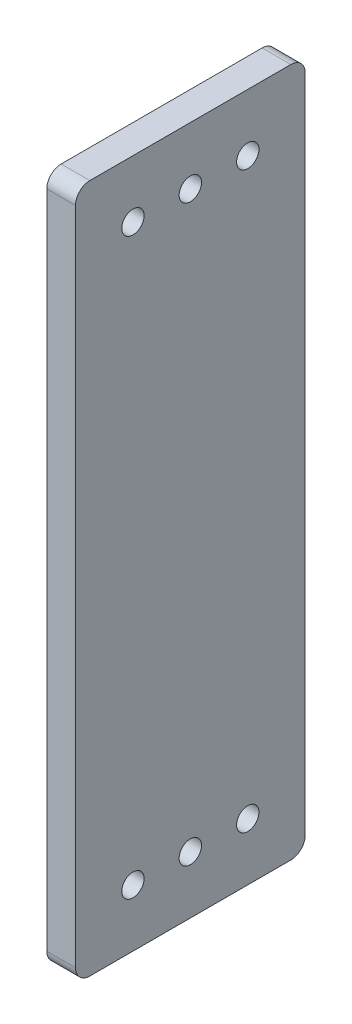
ISO-10303-21;
HEADER;
FILE_DESCRIPTION(('STEP AP214'),'2;1');
FILE_NAME('part.step','',(''),(''),'','','');
FILE_SCHEMA(('AUTOMOTIVE_DESIGN { 1 0 10303 214 1 1 1 1 }'));
ENDSEC;
DATA;
#1=APPLICATION_CONTEXT('core data for automotive mechanical design processes');
#2=APPLICATION_PROTOCOL_DEFINITION('international standard','automotive_design',2000,#1);
#3=PRODUCT_CONTEXT('',#1,'mechanical');
#4=PRODUCT('Part','Part','',(#3));
#5=PRODUCT_RELATED_PRODUCT_CATEGORY('part','',(#4));
#6=PRODUCT_DEFINITION_FORMATION('','',#4);
#7=PRODUCT_DEFINITION_CONTEXT('part definition',#1,'design');
#8=PRODUCT_DEFINITION('design','',#6,#7);
#9=PRODUCT_DEFINITION_SHAPE('','',#8);
#10=(LENGTH_UNIT() NAMED_UNIT(*) SI_UNIT(.MILLI.,.METRE.));
#11=(NAMED_UNIT(*) PLANE_ANGLE_UNIT() SI_UNIT($,.RADIAN.));
#12=(NAMED_UNIT(*) SI_UNIT($,.STERADIAN.) SOLID_ANGLE_UNIT());
#13=UNCERTAINTY_MEASURE_WITH_UNIT(LENGTH_MEASURE(1.E-05),#10,'distance_accuracy_value','');
#14=(GEOMETRIC_REPRESENTATION_CONTEXT(3) GLOBAL_UNCERTAINTY_ASSIGNED_CONTEXT((#13)) GLOBAL_UNIT_ASSIGNED_CONTEXT((#10,
#11,#12)) REPRESENTATION_CONTEXT('',''));
#15=CARTESIAN_POINT('',(0.,0.,0.));
#16=DIRECTION('',(0.,0.,1.));
#17=DIRECTION('',(1.,0.,0.));
#18=AXIS2_PLACEMENT_3D('',#15,#16,#17);
#19=CARTESIAN_POINT('',(44.45,177.8,-50.8));
#20=DIRECTION('',(0.,0.,1.));
#21=DIRECTION('',(1.,0.,0.));
#22=AXIS2_PLACEMENT_3D('',#19,#20,#21);
#23=PLANE('',#22);
#24=DIRECTION('',(0.,1.,0.));
#25=VECTOR('',#24,1.);
#26=CARTESIAN_POINT('',(44.45,177.8,-50.8));
#27=LINE('',#26,#25);
#28=CARTESIAN_POINT('',(44.45,28.575,-50.8));
#29=VERTEX_POINT('',#28);
#30=CARTESIAN_POINT('',(44.45,174.625,-50.8));
#31=VERTEX_POINT('',#30);
#32=EDGE_CURVE('E124',#29,#31,#27,.T.);
#33=ORIENTED_EDGE('',*,*,#32,.F.);
#34=DIRECTION('',(-1.,0.,0.));
#35=VECTOR('',#34,1.);
#36=CARTESIAN_POINT('',(44.45,28.575,-50.8));
#37=LINE('',#36,#35);
#38=CARTESIAN_POINT('',(38.1,28.575,-50.8));
#39=VERTEX_POINT('',#38);
#40=EDGE_CURVE('E109',#29,#39,#37,.T.);
#41=ORIENTED_EDGE('',*,*,#40,.T.);
#42=DIRECTION('',(0.,1.,0.));
#43=VECTOR('',#42,1.);
#44=CARTESIAN_POINT('',(38.1,177.8,-50.8));
#45=LINE('',#44,#43);
#46=CARTESIAN_POINT('',(38.1,174.625,-50.8));
#47=VERTEX_POINT('',#46);
#48=EDGE_CURVE('E121',#39,#47,#45,.T.);
#49=ORIENTED_EDGE('',*,*,#48,.T.);
#50=DIRECTION('',(-1.,0.,0.));
#51=VECTOR('',#50,1.);
#52=CARTESIAN_POINT('',(44.45,174.625,-50.8));
#53=LINE('',#52,#51);
#54=EDGE_CURVE('E126',#47,#31,#53,.F.);
#55=ORIENTED_EDGE('',*,*,#54,.T.);
#56=EDGE_LOOP('',(#33,#41,#49,#55));
#57=FACE_BOUND('',#56,.T.);
#58=ADVANCED_FACE('F39',(#57),#23,.F.);
#59=CARTESIAN_POINT('',(44.45,177.8,-50.8));
#60=DIRECTION('',(0.,-1.,0.));
#61=DIRECTION('',(0.,0.,-1.));
#62=AXIS2_PLACEMENT_3D('',#59,#60,#61);
#63=PLANE('',#62);
#64=DIRECTION('',(0.,0.,1.));
#65=VECTOR('',#64,1.);
#66=CARTESIAN_POINT('',(38.1,177.8,-50.8));
#67=LINE('',#66,#65);
#68=CARTESIAN_POINT('',(38.1,177.8,-47.625));
#69=VERTEX_POINT('',#68);
#70=CARTESIAN_POINT('',(38.1,177.8,-3.17500000000001));
#71=VERTEX_POINT('',#70);
#72=EDGE_CURVE('E131',#69,#71,#67,.T.);
#73=ORIENTED_EDGE('',*,*,#72,.T.);
#74=DIRECTION('',(-1.,0.,0.));
#75=VECTOR('',#74,1.);
#76=CARTESIAN_POINT('',(44.45,177.8,-3.175));
#77=LINE('',#76,#75);
#78=CARTESIAN_POINT('',(44.45,177.8,-3.17500000000001));
#79=VERTEX_POINT('',#78);
#80=EDGE_CURVE('E11',#71,#79,#77,.F.);
#81=ORIENTED_EDGE('',*,*,#80,.T.);
#82=DIRECTION('',(0.,0.,1.));
#83=VECTOR('',#82,1.);
#84=CARTESIAN_POINT('',(44.45,177.8,-50.8));
#85=LINE('',#84,#83);
#86=CARTESIAN_POINT('',(44.45,177.8,-47.625));
#87=VERTEX_POINT('',#86);
#88=EDGE_CURVE('E170',#87,#79,#85,.T.);
#89=ORIENTED_EDGE('',*,*,#88,.F.);
#90=DIRECTION('',(-1.,0.,0.));
#91=VECTOR('',#90,1.);
#92=CARTESIAN_POINT('',(44.45,177.8,-47.625));
#93=LINE('',#92,#91);
#94=EDGE_CURVE('E47',#87,#69,#93,.T.);
#95=ORIENTED_EDGE('',*,*,#94,.T.);
#96=EDGE_LOOP('',(#73,#81,#89,#95));
#97=FACE_BOUND('',#96,.T.);
#98=ADVANCED_FACE('F168',(#97),#63,.F.);
#99=CARTESIAN_POINT('',(44.45,177.8,0.));
#100=DIRECTION('',(0.,0.,-1.));
#101=DIRECTION('',(-1.,0.,0.));
#102=AXIS2_PLACEMENT_3D('',#99,#100,#101);
#103=PLANE('',#102);
#104=DIRECTION('',(0.,-1.,0.));
#105=VECTOR('',#104,1.);
#106=CARTESIAN_POINT('',(44.45,177.8,0.));
#107=LINE('',#106,#105);
#108=CARTESIAN_POINT('',(44.45,174.625,0.));
#109=VERTEX_POINT('',#108);
#110=CARTESIAN_POINT('',(44.45,28.575,0.));
#111=VERTEX_POINT('',#110);
#112=EDGE_CURVE('E178',#109,#111,#107,.T.);
#113=ORIENTED_EDGE('',*,*,#112,.F.);
#114=DIRECTION('',(-1.,0.,0.));
#115=VECTOR('',#114,1.);
#116=CARTESIAN_POINT('',(44.45,174.625,0.));
#117=LINE('',#116,#115);
#118=CARTESIAN_POINT('',(38.1,174.625,0.));
#119=VERTEX_POINT('',#118);
#120=EDGE_CURVE('E162',#109,#119,#117,.T.);
#121=ORIENTED_EDGE('',*,*,#120,.T.);
#122=DIRECTION('',(0.,-1.,0.));
#123=VECTOR('',#122,1.);
#124=CARTESIAN_POINT('',(38.1,177.8,0.));
#125=LINE('',#124,#123);
#126=CARTESIAN_POINT('',(38.1,28.575,0.));
#127=VERTEX_POINT('',#126);
#128=EDGE_CURVE('E135',#119,#127,#125,.T.);
#129=ORIENTED_EDGE('',*,*,#128,.T.);
#130=DIRECTION('',(-1.,0.,0.));
#131=VECTOR('',#130,1.);
#132=CARTESIAN_POINT('',(44.45,28.575,0.));
#133=LINE('',#132,#131);
#134=EDGE_CURVE('E54',#127,#111,#133,.F.);
#135=ORIENTED_EDGE('',*,*,#134,.T.);
#136=EDGE_LOOP('',(#113,#121,#129,#135));
#137=FACE_BOUND('',#136,.T.);
#138=ADVANCED_FACE('F177',(#137),#103,.F.);
#139=CARTESIAN_POINT('',(44.45,25.4,-50.8));
#140=DIRECTION('',(0.,1.,0.));
#141=DIRECTION('',(0.,0.,1.));
#142=AXIS2_PLACEMENT_3D('',#139,#140,#141);
#143=PLANE('',#142);
#144=DIRECTION('',(0.,0.,-1.));
#145=VECTOR('',#144,1.);
#146=CARTESIAN_POINT('',(38.1,25.4,-50.8));
#147=LINE('',#146,#145);
#148=CARTESIAN_POINT('',(38.1,25.4,-3.17500000000001));
#149=VERTEX_POINT('',#148);
#150=CARTESIAN_POINT('',(38.1,25.4,-47.625));
#151=VERTEX_POINT('',#150);
#152=EDGE_CURVE('E145',#149,#151,#147,.T.);
#153=ORIENTED_EDGE('',*,*,#152,.T.);
#154=DIRECTION('',(-1.,0.,0.));
#155=VECTOR('',#154,1.);
#156=CARTESIAN_POINT('',(44.45,25.4,-47.625));
#157=LINE('',#156,#155);
#158=CARTESIAN_POINT('',(44.45,25.4,-47.625));
#159=VERTEX_POINT('',#158);
#160=EDGE_CURVE('E110',#151,#159,#157,.F.);
#161=ORIENTED_EDGE('',*,*,#160,.T.);
#162=DIRECTION('',(0.,0.,-1.));
#163=VECTOR('',#162,1.);
#164=CARTESIAN_POINT('',(44.45,25.4,-50.8));
#165=LINE('',#164,#163);
#166=CARTESIAN_POINT('',(44.45,25.4,-3.17500000000001));
#167=VERTEX_POINT('',#166);
#168=EDGE_CURVE('E141',#167,#159,#165,.T.);
#169=ORIENTED_EDGE('',*,*,#168,.F.);
#170=DIRECTION('',(-1.,0.,0.));
#171=VECTOR('',#170,1.);
#172=CARTESIAN_POINT('',(44.45,25.4,-3.175));
#173=LINE('',#172,#171);
#174=EDGE_CURVE('E115',#167,#149,#173,.T.);
#175=ORIENTED_EDGE('',*,*,#174,.T.);
#176=EDGE_LOOP('',(#153,#161,#169,#175));
#177=FACE_BOUND('',#176,.T.);
#178=ADVANCED_FACE('F223',(#177),#143,.F.);
#179=CARTESIAN_POINT('',(44.45,0.,0.));
#180=DIRECTION('',(-1.,0.,0.));
#181=DIRECTION('',(0.,0.,1.));
#182=AXIS2_PLACEMENT_3D('',#179,#180,#181);
#183=PLANE('',#182);
#184=CARTESIAN_POINT('',(44.45,38.1,-12.7));
#185=DIRECTION('',(-1.,0.,0.));
#186=DIRECTION('',(0.,0.,1.));
#187=AXIS2_PLACEMENT_3D('',#184,#185,#186);
#188=CIRCLE('',#187,2.4765);
#189=CARTESIAN_POINT('',(44.45,38.1,-10.2235));
#190=VERTEX_POINT('',#189);
#191=EDGE_CURVE('E191',#190,#190,#188,.F.);
#192=ORIENTED_EDGE('',*,*,#191,.F.);
#193=EDGE_LOOP('',(#192));
#194=FACE_BOUND('',#193,.T.);
#195=CARTESIAN_POINT('',(44.45,38.1,-25.4));
#196=DIRECTION('',(-1.,0.,0.));
#197=DIRECTION('',(0.,0.,1.));
#198=AXIS2_PLACEMENT_3D('',#195,#196,#197);
#199=CIRCLE('',#198,2.4765);
#200=CARTESIAN_POINT('',(44.45,38.1,-22.9235));
#201=VERTEX_POINT('',#200);
#202=EDGE_CURVE('E190',#201,#201,#199,.F.);
#203=ORIENTED_EDGE('',*,*,#202,.F.);
#204=EDGE_LOOP('',(#203));
#205=FACE_BOUND('',#204,.T.);
#206=CARTESIAN_POINT('',(44.45,38.1,-38.1));
#207=DIRECTION('',(-1.,0.,0.));
#208=DIRECTION('',(0.,0.,1.));
#209=AXIS2_PLACEMENT_3D('',#206,#207,#208);
#210=CIRCLE('',#209,2.47650000000001);
#211=CARTESIAN_POINT('',(44.45,38.1,-35.6235));
#212=VERTEX_POINT('',#211);
#213=EDGE_CURVE('E197',#212,#212,#210,.F.);
#214=ORIENTED_EDGE('',*,*,#213,.F.);
#215=EDGE_LOOP('',(#214));
#216=FACE_BOUND('',#215,.T.);
#217=CARTESIAN_POINT('',(44.45,165.1,-38.1));
#218=DIRECTION('',(-1.,0.,0.));
#219=DIRECTION('',(0.,0.,1.));
#220=AXIS2_PLACEMENT_3D('',#217,#218,#219);
#221=CIRCLE('',#220,2.47650000000002);
#222=CARTESIAN_POINT('',(44.45,165.1,-35.6235));
#223=VERTEX_POINT('',#222);
#224=EDGE_CURVE('E203',#223,#223,#221,.F.);
#225=ORIENTED_EDGE('',*,*,#224,.F.);
#226=EDGE_LOOP('',(#225));
#227=FACE_BOUND('',#226,.T.);
#228=CARTESIAN_POINT('',(44.45,165.1,-25.4));
#229=DIRECTION('',(-1.,0.,0.));
#230=DIRECTION('',(0.,0.,1.));
#231=AXIS2_PLACEMENT_3D('',#228,#229,#230);
#232=CIRCLE('',#231,2.47650000000001);
#233=CARTESIAN_POINT('',(44.45,165.1,-22.9235));
#234=VERTEX_POINT('',#233);
#235=EDGE_CURVE('E209',#234,#234,#232,.F.);
#236=ORIENTED_EDGE('',*,*,#235,.F.);
#237=EDGE_LOOP('',(#236));
#238=FACE_BOUND('',#237,.T.);
#239=CARTESIAN_POINT('',(44.45,165.1,-12.7));
#240=DIRECTION('',(-1.,0.,0.));
#241=DIRECTION('',(0.,0.,1.));
#242=AXIS2_PLACEMENT_3D('',#239,#240,#241);
#243=CIRCLE('',#242,2.47650000000001);
#244=CARTESIAN_POINT('',(44.45,165.1,-10.2235));
#245=VERTEX_POINT('',#244);
#246=EDGE_CURVE('E132',#245,#245,#243,.F.);
#247=ORIENTED_EDGE('',*,*,#246,.F.);
#248=EDGE_LOOP('',(#247));
#249=FACE_BOUND('',#248,.T.);
#250=ORIENTED_EDGE('',*,*,#168,.T.);
#251=CARTESIAN_POINT('',(44.45,28.575,-47.625));
#252=DIRECTION('',(-1.,0.,0.));
#253=DIRECTION('',(0.,0.,1.));
#254=AXIS2_PLACEMENT_3D('',#251,#252,#253);
#255=CIRCLE('',#254,3.175);
#256=EDGE_CURVE('E159',#159,#29,#255,.F.);
#257=ORIENTED_EDGE('',*,*,#256,.T.);
#258=ORIENTED_EDGE('',*,*,#32,.T.);
#259=CARTESIAN_POINT('',(44.45,174.625,-47.625));
#260=DIRECTION('',(-1.,0.,0.));
#261=DIRECTION('',(0.,0.,1.));
#262=AXIS2_PLACEMENT_3D('',#259,#260,#261);
#263=CIRCLE('',#262,3.175);
#264=EDGE_CURVE('E156',#31,#87,#263,.F.);
#265=ORIENTED_EDGE('',*,*,#264,.T.);
#266=ORIENTED_EDGE('',*,*,#88,.T.);
#267=CARTESIAN_POINT('',(44.45,174.625,-3.175));
#268=DIRECTION('',(-1.,0.,0.));
#269=DIRECTION('',(0.,0.,1.));
#270=AXIS2_PLACEMENT_3D('',#267,#268,#269);
#271=CIRCLE('',#270,3.175);
#272=EDGE_CURVE('E61',#79,#109,#271,.F.);
#273=ORIENTED_EDGE('',*,*,#272,.T.);
#274=ORIENTED_EDGE('',*,*,#112,.T.);
#275=CARTESIAN_POINT('',(44.45,28.575,-3.175));
#276=DIRECTION('',(-1.,0.,0.));
#277=DIRECTION('',(0.,0.,1.));
#278=AXIS2_PLACEMENT_3D('',#275,#276,#277);
#279=CIRCLE('',#278,3.175);
#280=EDGE_CURVE('E154',#111,#167,#279,.F.);
#281=ORIENTED_EDGE('',*,*,#280,.T.);
#282=EDGE_LOOP('',(#250,#257,#258,#265,#266,#273,#274,#281));
#283=FACE_BOUND('',#282,.T.);
#284=ADVANCED_FACE('F220',(#194,#205,#216,#227,#238,#249,#283),#183,.F.);
#285=CARTESIAN_POINT('',(38.1,0.,0.));
#286=DIRECTION('',(-1.,0.,0.));
#287=DIRECTION('',(0.,0.,1.));
#288=AXIS2_PLACEMENT_3D('',#285,#286,#287);
#289=PLANE('',#288);
#290=CARTESIAN_POINT('',(38.1,38.1,-12.7));
#291=DIRECTION('',(-1.,0.,0.));
#292=DIRECTION('',(0.,0.,1.));
#293=AXIS2_PLACEMENT_3D('',#290,#291,#292);
#294=CIRCLE('',#293,2.4765);
#295=CARTESIAN_POINT('',(38.1,38.1,-10.2235));
#296=VERTEX_POINT('',#295);
#297=EDGE_CURVE('E187',#296,#296,#294,.T.);
#298=ORIENTED_EDGE('',*,*,#297,.F.);
#299=EDGE_LOOP('',(#298));
#300=FACE_BOUND('',#299,.T.);
#301=CARTESIAN_POINT('',(38.1,38.1,-25.4));
#302=DIRECTION('',(-1.,0.,0.));
#303=DIRECTION('',(0.,0.,1.));
#304=AXIS2_PLACEMENT_3D('',#301,#302,#303);
#305=CIRCLE('',#304,2.4765);
#306=CARTESIAN_POINT('',(38.1,38.1,-22.9235));
#307=VERTEX_POINT('',#306);
#308=EDGE_CURVE('E194',#307,#307,#305,.T.);
#309=ORIENTED_EDGE('',*,*,#308,.F.);
#310=EDGE_LOOP('',(#309));
#311=FACE_BOUND('',#310,.T.);
#312=CARTESIAN_POINT('',(38.1,38.1,-38.1));
#313=DIRECTION('',(-1.,0.,0.));
#314=DIRECTION('',(0.,0.,1.));
#315=AXIS2_PLACEMENT_3D('',#312,#313,#314);
#316=CIRCLE('',#315,2.47650000000001);
#317=CARTESIAN_POINT('',(38.1,38.1,-35.6235));
#318=VERTEX_POINT('',#317);
#319=EDGE_CURVE('E200',#318,#318,#316,.T.);
#320=ORIENTED_EDGE('',*,*,#319,.F.);
#321=EDGE_LOOP('',(#320));
#322=FACE_BOUND('',#321,.T.);
#323=CARTESIAN_POINT('',(38.1,165.1,-38.1));
#324=DIRECTION('',(-1.,0.,0.));
#325=DIRECTION('',(0.,0.,1.));
#326=AXIS2_PLACEMENT_3D('',#323,#324,#325);
#327=CIRCLE('',#326,2.47650000000002);
#328=CARTESIAN_POINT('',(38.1,165.1,-35.6235));
#329=VERTEX_POINT('',#328);
#330=EDGE_CURVE('E206',#329,#329,#327,.T.);
#331=ORIENTED_EDGE('',*,*,#330,.F.);
#332=EDGE_LOOP('',(#331));
#333=FACE_BOUND('',#332,.T.);
#334=CARTESIAN_POINT('',(38.1,165.1,-25.4));
#335=DIRECTION('',(-1.,0.,0.));
#336=DIRECTION('',(0.,0.,1.));
#337=AXIS2_PLACEMENT_3D('',#334,#335,#336);
#338=CIRCLE('',#337,2.47650000000001);
#339=CARTESIAN_POINT('',(38.1,165.1,-22.9235));
#340=VERTEX_POINT('',#339);
#341=EDGE_CURVE('E186',#340,#340,#338,.T.);
#342=ORIENTED_EDGE('',*,*,#341,.F.);
#343=EDGE_LOOP('',(#342));
#344=FACE_BOUND('',#343,.T.);
#345=CARTESIAN_POINT('',(38.1,165.1,-12.7));
#346=DIRECTION('',(-1.,0.,0.));
#347=DIRECTION('',(0.,0.,1.));
#348=AXIS2_PLACEMENT_3D('',#345,#346,#347);
#349=CIRCLE('',#348,2.47650000000001);
#350=CARTESIAN_POINT('',(38.1,165.1,-10.2235));
#351=VERTEX_POINT('',#350);
#352=EDGE_CURVE('E138',#351,#351,#349,.T.);
#353=ORIENTED_EDGE('',*,*,#352,.F.);
#354=EDGE_LOOP('',(#353));
#355=FACE_BOUND('',#354,.T.);
#356=ORIENTED_EDGE('',*,*,#48,.F.);
#357=CARTESIAN_POINT('',(38.1,28.575,-47.625));
#358=DIRECTION('',(-1.,0.,0.));
#359=DIRECTION('',(0.,0.,1.));
#360=AXIS2_PLACEMENT_3D('',#357,#358,#359);
#361=CIRCLE('',#360,3.175);
#362=EDGE_CURVE('E105',#39,#151,#361,.T.);
#363=ORIENTED_EDGE('',*,*,#362,.T.);
#364=ORIENTED_EDGE('',*,*,#152,.F.);
#365=CARTESIAN_POINT('',(38.1,28.575,-3.175));
#366=DIRECTION('',(-1.,0.,0.));
#367=DIRECTION('',(0.,0.,1.));
#368=AXIS2_PLACEMENT_3D('',#365,#366,#367);
#369=CIRCLE('',#368,3.175);
#370=EDGE_CURVE('E125',#149,#127,#369,.T.);
#371=ORIENTED_EDGE('',*,*,#370,.T.);
#372=ORIENTED_EDGE('',*,*,#128,.F.);
#373=CARTESIAN_POINT('',(38.1,174.625,-3.175));
#374=DIRECTION('',(-1.,0.,0.));
#375=DIRECTION('',(0.,0.,1.));
#376=AXIS2_PLACEMENT_3D('',#373,#374,#375);
#377=CIRCLE('',#376,3.175);
#378=EDGE_CURVE('E116',#119,#71,#377,.T.);
#379=ORIENTED_EDGE('',*,*,#378,.T.);
#380=ORIENTED_EDGE('',*,*,#72,.F.);
#381=CARTESIAN_POINT('',(38.1,174.625,-47.625));
#382=DIRECTION('',(-1.,0.,0.));
#383=DIRECTION('',(0.,0.,1.));
#384=AXIS2_PLACEMENT_3D('',#381,#382,#383);
#385=CIRCLE('',#384,3.175);
#386=EDGE_CURVE('E130',#69,#47,#385,.T.);
#387=ORIENTED_EDGE('',*,*,#386,.T.);
#388=EDGE_LOOP('',(#356,#363,#364,#371,#372,#379,#380,#387));
#389=FACE_BOUND('',#388,.T.);
#390=ADVANCED_FACE('F128',(#300,#311,#322,#333,#344,#355,#389),#289,.T.);
#391=CARTESIAN_POINT('',(51.454599774434,165.1,-12.7));
#392=DIRECTION('',(-1.,0.,0.));
#393=DIRECTION('',(0.,0.,1.));
#394=AXIS2_PLACEMENT_3D('',#391,#392,#393);
#395=CYLINDRICAL_SURFACE('',#394,2.47650000000001);
#396=ORIENTED_EDGE('',*,*,#246,.T.);
#397=EDGE_LOOP('',(#396));
#398=FACE_BOUND('',#397,.T.);
#399=ORIENTED_EDGE('',*,*,#352,.T.);
#400=EDGE_LOOP('',(#399));
#401=FACE_BOUND('',#400,.T.);
#402=ADVANCED_FACE('F321',(#398,#401),#395,.F.);
#403=CARTESIAN_POINT('',(51.454599774434,165.1,-25.4));
#404=DIRECTION('',(-1.,0.,0.));
#405=DIRECTION('',(0.,0.,1.));
#406=AXIS2_PLACEMENT_3D('',#403,#404,#405);
#407=CYLINDRICAL_SURFACE('',#406,2.47650000000001);
#408=ORIENTED_EDGE('',*,*,#235,.T.);
#409=EDGE_LOOP('',(#408));
#410=FACE_BOUND('',#409,.T.);
#411=ORIENTED_EDGE('',*,*,#341,.T.);
#412=EDGE_LOOP('',(#411));
#413=FACE_BOUND('',#412,.T.);
#414=ADVANCED_FACE('F217',(#410,#413),#407,.F.);
#415=CARTESIAN_POINT('',(51.454599774434,165.1,-38.1));
#416=DIRECTION('',(-1.,0.,0.));
#417=DIRECTION('',(0.,0.,1.));
#418=AXIS2_PLACEMENT_3D('',#415,#416,#417);
#419=CYLINDRICAL_SURFACE('',#418,2.47650000000002);
#420=ORIENTED_EDGE('',*,*,#224,.T.);
#421=EDGE_LOOP('',(#420));
#422=FACE_BOUND('',#421,.T.);
#423=ORIENTED_EDGE('',*,*,#330,.T.);
#424=EDGE_LOOP('',(#423));
#425=FACE_BOUND('',#424,.T.);
#426=ADVANCED_FACE('F302',(#422,#425),#419,.F.);
#427=CARTESIAN_POINT('',(51.454599774434,38.1,-38.1));
#428=DIRECTION('',(-1.,0.,0.));
#429=DIRECTION('',(0.,0.,1.));
#430=AXIS2_PLACEMENT_3D('',#427,#428,#429);
#431=CYLINDRICAL_SURFACE('',#430,2.47650000000001);
#432=ORIENTED_EDGE('',*,*,#213,.T.);
#433=EDGE_LOOP('',(#432));
#434=FACE_BOUND('',#433,.T.);
#435=ORIENTED_EDGE('',*,*,#319,.T.);
#436=EDGE_LOOP('',(#435));
#437=FACE_BOUND('',#436,.T.);
#438=ADVANCED_FACE('F292',(#434,#437),#431,.F.);
#439=CARTESIAN_POINT('',(51.454599774434,38.1,-25.4));
#440=DIRECTION('',(-1.,0.,0.));
#441=DIRECTION('',(0.,0.,1.));
#442=AXIS2_PLACEMENT_3D('',#439,#440,#441);
#443=CYLINDRICAL_SURFACE('',#442,2.4765);
#444=ORIENTED_EDGE('',*,*,#202,.T.);
#445=EDGE_LOOP('',(#444));
#446=FACE_BOUND('',#445,.T.);
#447=ORIENTED_EDGE('',*,*,#308,.T.);
#448=EDGE_LOOP('',(#447));
#449=FACE_BOUND('',#448,.T.);
#450=ADVANCED_FACE('F282',(#446,#449),#443,.F.);
#451=CARTESIAN_POINT('',(51.454599774434,38.1,-12.7));
#452=DIRECTION('',(-1.,0.,0.));
#453=DIRECTION('',(0.,0.,1.));
#454=AXIS2_PLACEMENT_3D('',#451,#452,#453);
#455=CYLINDRICAL_SURFACE('',#454,2.4765);
#456=ORIENTED_EDGE('',*,*,#191,.T.);
#457=EDGE_LOOP('',(#456));
#458=FACE_BOUND('',#457,.T.);
#459=ORIENTED_EDGE('',*,*,#297,.T.);
#460=EDGE_LOOP('',(#459));
#461=FACE_BOUND('',#460,.T.);
#462=ADVANCED_FACE('F246',(#458,#461),#455,.F.);
#463=CARTESIAN_POINT('',(44.45,28.575,-47.625));
#464=DIRECTION('',(-1.,0.,0.));
#465=DIRECTION('',(0.,0.,1.));
#466=AXIS2_PLACEMENT_3D('',#463,#464,#465);
#467=CYLINDRICAL_SURFACE('',#466,3.175);
#468=ORIENTED_EDGE('',*,*,#256,.F.);
#469=ORIENTED_EDGE('',*,*,#160,.F.);
#470=ORIENTED_EDGE('',*,*,#362,.F.);
#471=ORIENTED_EDGE('',*,*,#40,.F.);
#472=EDGE_LOOP('',(#468,#469,#470,#471));
#473=FACE_BOUND('',#472,.T.);
#474=ADVANCED_FACE('F108',(#473),#467,.T.);
#475=CARTESIAN_POINT('',(44.45,174.625,-3.175));
#476=DIRECTION('',(-1.,0.,0.));
#477=DIRECTION('',(0.,0.,1.));
#478=AXIS2_PLACEMENT_3D('',#475,#476,#477);
#479=CYLINDRICAL_SURFACE('',#478,3.175);
#480=ORIENTED_EDGE('',*,*,#272,.F.);
#481=ORIENTED_EDGE('',*,*,#80,.F.);
#482=ORIENTED_EDGE('',*,*,#378,.F.);
#483=ORIENTED_EDGE('',*,*,#120,.F.);
#484=EDGE_LOOP('',(#480,#481,#482,#483));
#485=FACE_BOUND('',#484,.T.);
#486=ADVANCED_FACE('F176',(#485),#479,.T.);
#487=CARTESIAN_POINT('',(44.45,174.625,-47.625));
#488=DIRECTION('',(-1.,0.,0.));
#489=DIRECTION('',(0.,0.,1.));
#490=AXIS2_PLACEMENT_3D('',#487,#488,#489);
#491=CYLINDRICAL_SURFACE('',#490,3.175);
#492=ORIENTED_EDGE('',*,*,#264,.F.);
#493=ORIENTED_EDGE('',*,*,#54,.F.);
#494=ORIENTED_EDGE('',*,*,#386,.F.);
#495=ORIENTED_EDGE('',*,*,#94,.F.);
#496=EDGE_LOOP('',(#492,#493,#494,#495));
#497=FACE_BOUND('',#496,.T.);
#498=ADVANCED_FACE('F232',(#497),#491,.T.);
#499=CARTESIAN_POINT('',(44.45,28.575,-3.175));
#500=DIRECTION('',(-1.,0.,0.));
#501=DIRECTION('',(0.,0.,1.));
#502=AXIS2_PLACEMENT_3D('',#499,#500,#501);
#503=CYLINDRICAL_SURFACE('',#502,3.175);
#504=ORIENTED_EDGE('',*,*,#280,.F.);
#505=ORIENTED_EDGE('',*,*,#134,.F.);
#506=ORIENTED_EDGE('',*,*,#370,.F.);
#507=ORIENTED_EDGE('',*,*,#174,.F.);
#508=EDGE_LOOP('',(#504,#505,#506,#507));
#509=FACE_BOUND('',#508,.T.);
#510=ADVANCED_FACE('F41',(#509),#503,.T.);
#511=CLOSED_SHELL('',(#58,#98,#138,#178,#284,#390,#402,#414,#426,#438,#450,#462,#474,#486,#498,#510));
#512=MANIFOLD_SOLID_BREP('B2',#511);
#513=ADVANCED_BREP_SHAPE_REPRESENTATION('',(#18,#512),#14);
#514=SHAPE_DEFINITION_REPRESENTATION(#9,#513);
ENDSEC;
END-ISO-10303-21;
